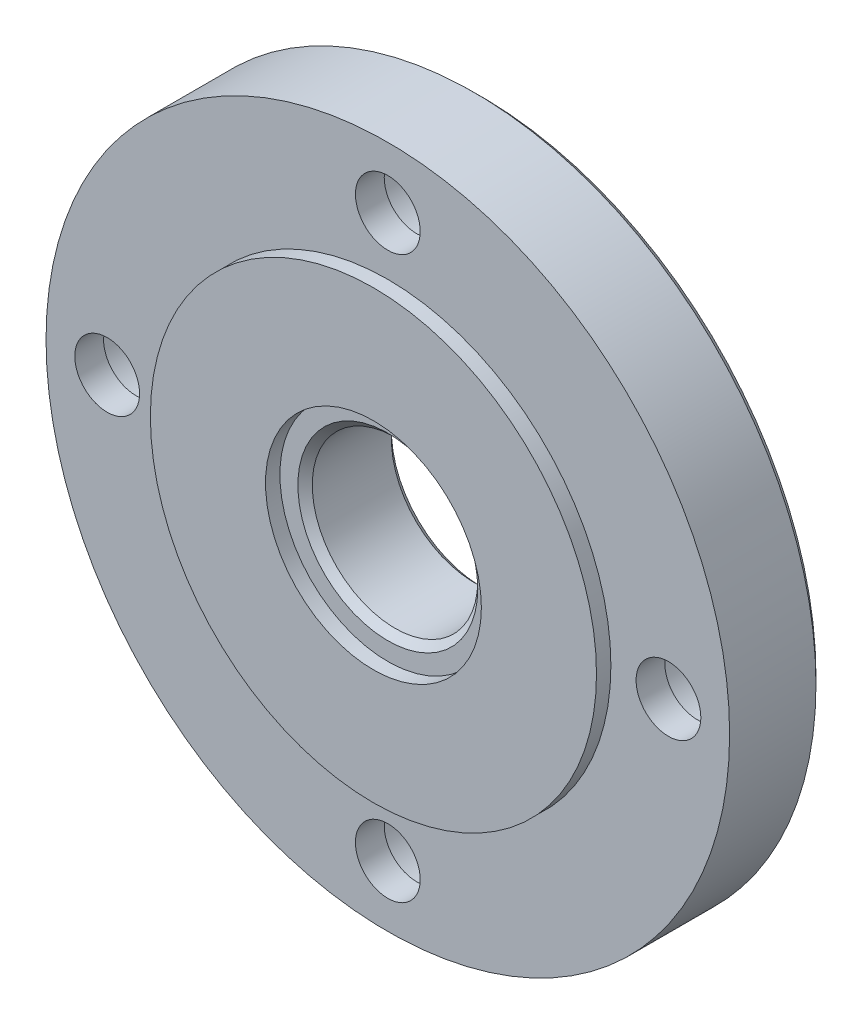
ISO-10303-21;
HEADER;
FILE_DESCRIPTION(('STEP AP214'),'2;1');
FILE_NAME('part.step','',(''),(''),'','','');
FILE_SCHEMA(('AUTOMOTIVE_DESIGN { 1 0 10303 214 1 1 1 1 }'));
ENDSEC;
DATA;
#1=APPLICATION_CONTEXT('core data for automotive mechanical design processes');
#2=APPLICATION_PROTOCOL_DEFINITION('international standard','automotive_design',2000,#1);
#3=PRODUCT_CONTEXT('',#1,'mechanical');
#4=PRODUCT('Part','Part','',(#3));
#5=PRODUCT_RELATED_PRODUCT_CATEGORY('part','',(#4));
#6=PRODUCT_DEFINITION_FORMATION('','',#4);
#7=PRODUCT_DEFINITION_CONTEXT('part definition',#1,'design');
#8=PRODUCT_DEFINITION('design','',#6,#7);
#9=PRODUCT_DEFINITION_SHAPE('','',#8);
#10=(LENGTH_UNIT() NAMED_UNIT(*) SI_UNIT(.MILLI.,.METRE.));
#11=(NAMED_UNIT(*) PLANE_ANGLE_UNIT() SI_UNIT($,.RADIAN.));
#12=(NAMED_UNIT(*) SI_UNIT($,.STERADIAN.) SOLID_ANGLE_UNIT());
#13=UNCERTAINTY_MEASURE_WITH_UNIT(LENGTH_MEASURE(1.E-05),#10,'distance_accuracy_value','');
#14=(GEOMETRIC_REPRESENTATION_CONTEXT(3) GLOBAL_UNCERTAINTY_ASSIGNED_CONTEXT((#13)) GLOBAL_UNIT_ASSIGNED_CONTEXT((#10,
#11,#12)) REPRESENTATION_CONTEXT('',''));
#15=CARTESIAN_POINT('',(0.,0.,0.));
#16=DIRECTION('',(0.,0.,1.));
#17=DIRECTION('',(1.,0.,0.));
#18=AXIS2_PLACEMENT_3D('',#15,#16,#17);
#19=CARTESIAN_POINT('',(0.,0.,13.));
#20=DIRECTION('',(0.,0.,-1.));
#21=DIRECTION('',(-1.,0.,0.));
#22=AXIS2_PLACEMENT_3D('',#19,#20,#21);
#23=CYLINDRICAL_SURFACE('',#22,47.5);
#24=CARTESIAN_POINT('',(0.,0.,1.00000000000004));
#25=DIRECTION('',(0.,0.,1.));
#26=DIRECTION('',(1.,0.,0.));
#27=AXIS2_PLACEMENT_3D('',#24,#25,#26);
#28=CIRCLE('',#27,47.5);
#29=CARTESIAN_POINT('',(-47.5,0.,1.00000000000004));
#30=VERTEX_POINT('',#29);
#31=EDGE_CURVE('E54',#30,#30,#28,.T.);
#32=CARTESIAN_POINT('',(0.,0.,13.));
#33=DIRECTION('',(0.,0.,1.));
#34=DIRECTION('',(1.,0.,0.));
#35=AXIS2_PLACEMENT_3D('',#32,#33,#34);
#36=CIRCLE('',#35,47.5);
#37=CARTESIAN_POINT('',(-47.5,0.,13.));
#38=VERTEX_POINT('',#37);
#39=EDGE_CURVE('E85',#38,#38,#36,.T.);
#40=CARTESIAN_POINT('',(-47.5,0.,1.00000000000004));
#41=CARTESIAN_POINT('',(-47.5,0.,1.12500000000004));
#42=CARTESIAN_POINT('',(-47.5,0.,1.25000000000004));
#43=CARTESIAN_POINT('',(-47.5,0.,1.50000000000004));
#44=CARTESIAN_POINT('',(-47.5,0.,1.62500000000004));
#45=CARTESIAN_POINT('',(-47.5,0.,1.87500000000004));
#46=CARTESIAN_POINT('',(-47.5,0.,2.00000000000004));
#47=CARTESIAN_POINT('',(-47.5,0.,2.25000000000004));
#48=CARTESIAN_POINT('',(-47.5,0.,2.37500000000004));
#49=CARTESIAN_POINT('',(-47.5,0.,2.62500000000004));
#50=CARTESIAN_POINT('',(-47.5,0.,2.75000000000004));
#51=CARTESIAN_POINT('',(-47.5,0.,3.00000000000004));
#52=CARTESIAN_POINT('',(-47.5,0.,3.12500000000003));
#53=CARTESIAN_POINT('',(-47.5,0.,3.37500000000003));
#54=CARTESIAN_POINT('',(-47.5,0.,3.50000000000003));
#55=CARTESIAN_POINT('',(-47.5,0.,3.75000000000003));
#56=CARTESIAN_POINT('',(-47.5,0.,3.87500000000003));
#57=CARTESIAN_POINT('',(-47.5,0.,4.12500000000003));
#58=CARTESIAN_POINT('',(-47.5,0.,4.25000000000003));
#59=CARTESIAN_POINT('',(-47.5,0.,4.50000000000003));
#60=CARTESIAN_POINT('',(-47.5,0.,4.62500000000003));
#61=CARTESIAN_POINT('',(-47.5,0.,4.87500000000003));
#62=CARTESIAN_POINT('',(-47.5,0.,5.00000000000003));
#63=CARTESIAN_POINT('',(-47.5,0.,5.25000000000003));
#64=CARTESIAN_POINT('',(-47.5,0.,5.37500000000003));
#65=CARTESIAN_POINT('',(-47.5,0.,5.62500000000003));
#66=CARTESIAN_POINT('',(-47.5,0.,5.75000000000003));
#67=CARTESIAN_POINT('',(-47.5,0.,6.00000000000002));
#68=CARTESIAN_POINT('',(-47.5,0.,6.12500000000002));
#69=CARTESIAN_POINT('',(-47.5,0.,6.37500000000002));
#70=CARTESIAN_POINT('',(-47.5,0.,6.50000000000002));
#71=CARTESIAN_POINT('',(-47.5,0.,6.75000000000002));
#72=CARTESIAN_POINT('',(-47.5,0.,6.87500000000002));
#73=CARTESIAN_POINT('',(-47.5,0.,7.12500000000002));
#74=CARTESIAN_POINT('',(-47.5,0.,7.25000000000002));
#75=CARTESIAN_POINT('',(-47.5,0.,7.50000000000002));
#76=CARTESIAN_POINT('',(-47.5,0.,7.62500000000002));
#77=CARTESIAN_POINT('',(-47.5,0.,7.87500000000002));
#78=CARTESIAN_POINT('',(-47.5,0.,8.00000000000002));
#79=CARTESIAN_POINT('',(-47.5,0.,8.25000000000002));
#80=CARTESIAN_POINT('',(-47.5,0.,8.37500000000002));
#81=CARTESIAN_POINT('',(-47.5,0.,8.62500000000001));
#82=CARTESIAN_POINT('',(-47.5,0.,8.75000000000001));
#83=CARTESIAN_POINT('',(-47.5,0.,9.00000000000001));
#84=CARTESIAN_POINT('',(-47.5,0.,9.12500000000001));
#85=CARTESIAN_POINT('',(-47.5,0.,9.37500000000001));
#86=CARTESIAN_POINT('',(-47.5,0.,9.50000000000001));
#87=CARTESIAN_POINT('',(-47.5,0.,9.75000000000001));
#88=CARTESIAN_POINT('',(-47.5,0.,9.87500000000001));
#89=CARTESIAN_POINT('',(-47.5,0.,10.125));
#90=CARTESIAN_POINT('',(-47.5,0.,10.25));
#91=CARTESIAN_POINT('',(-47.5,0.,10.5));
#92=CARTESIAN_POINT('',(-47.5,0.,10.625));
#93=CARTESIAN_POINT('',(-47.5,0.,10.875));
#94=CARTESIAN_POINT('',(-47.5,0.,11.));
#95=CARTESIAN_POINT('',(-47.5,0.,11.25));
#96=CARTESIAN_POINT('',(-47.5,0.,11.375));
#97=CARTESIAN_POINT('',(-47.5,0.,11.625));
#98=CARTESIAN_POINT('',(-47.5,0.,11.75));
#99=CARTESIAN_POINT('',(-47.5,0.,12.));
#100=CARTESIAN_POINT('',(-47.5,0.,12.125));
#101=CARTESIAN_POINT('',(-47.5,0.,12.375));
#102=CARTESIAN_POINT('',(-47.5,0.,12.5));
#103=CARTESIAN_POINT('',(-47.5,0.,12.75));
#104=CARTESIAN_POINT('',(-47.5,0.,12.875));
#105=CARTESIAN_POINT('',(-47.5,0.,13.));
#106=B_SPLINE_CURVE_WITH_KNOTS('',3,(#40,#41,#42,#43,#44,#45,#46,#47,#48,#49,#50,#51,#52,#53,
#54,#55,#56,#57,#58,#59,#60,#61,#62,#63,#64,#65,#66,#67,#68,#69,#70,#71,#72,#73,#74,#75,#76,#77,
#78,#79,#80,#81,#82,#83,#84,#85,#86,#87,#88,#89,#90,#91,#92,#93,#94,#95,#96,#97,#98,#99,#100,
#101,#102,#103,#104,#105),.UNSPECIFIED.,.F.,.F.,(4,2,2,2,2,2,2,2,2,2,2,2,2,2,2,2,2,2,2,2,2,2,2,
2,2,2,2,2,2,2,2,2,4),(0.,0.374999999999999,0.749999999999997,1.125,1.49999999999999,
1.87499999999999,2.24999999999999,2.62499999999999,2.99999999999999,3.37499999999999,
3.74999999999999,4.12499999999999,4.49999999999998,4.87499999999998,5.24999999999998,
5.62499999999998,5.99999999999998,6.37499999999998,6.74999999999998,7.12499999999998,
7.49999999999997,7.87499999999997,8.24999999999997,8.62499999999997,8.99999999999997,
9.37499999999997,9.74999999999996,10.125,10.5,10.875,11.25,11.625,12.),.UNSPECIFIED.);
#107=EDGE_CURVE('BSEAM45',#30,#38,#106,.T.);
#108=ORIENTED_EDGE('',*,*,#31,.T.);
#109=ORIENTED_EDGE('',*,*,#39,.F.);
#110=ORIENTED_EDGE('',*,*,#107,.T.);
#111=ORIENTED_EDGE('',*,*,#107,.F.);
#112=EDGE_LOOP('',(#108,#110,#109,#111));
#113=FACE_BOUND('',#112,.T.);
#114=ADVANCED_FACE('F45',(#113),#23,.T.);
#115=CARTESIAN_POINT('',(0.,0.,13.));
#116=DIRECTION('',(0.,0.,1.));
#117=DIRECTION('',(1.,0.,0.));
#118=AXIS2_PLACEMENT_3D('',#115,#116,#117);
#119=PLANE('',#118);
#120=CARTESIAN_POINT('',(-39.,-1.36167772214882E-13,13.));
#121=DIRECTION('',(0.,0.,1.));
#122=DIRECTION('',(0.,1.,0.));
#123=AXIS2_PLACEMENT_3D('',#120,#121,#122);
#124=CIRCLE('',#123,4.5);
#125=CARTESIAN_POINT('',(-39.,4.49999999999987,13.));
#126=VERTEX_POINT('',#125);
#127=EDGE_CURVE('E136',#126,#126,#124,.T.);
#128=ORIENTED_EDGE('',*,*,#127,.F.);
#129=EDGE_LOOP('',(#128));
#130=FACE_BOUND('',#129,.T.);
#131=CARTESIAN_POINT('',(0.,-39.,13.));
#132=DIRECTION('',(0.,0.,1.));
#133=DIRECTION('',(-1.,0.,0.));
#134=AXIS2_PLACEMENT_3D('',#131,#132,#133);
#135=CIRCLE('',#134,4.5);
#136=CARTESIAN_POINT('',(-4.5,-39.,13.));
#137=VERTEX_POINT('',#136);
#138=EDGE_CURVE('E119',#137,#137,#135,.T.);
#139=ORIENTED_EDGE('',*,*,#138,.F.);
#140=EDGE_LOOP('',(#139));
#141=FACE_BOUND('',#140,.T.);
#142=CARTESIAN_POINT('',(39.,4.08503316644647E-13,13.));
#143=DIRECTION('',(0.,0.,1.));
#144=DIRECTION('',(0.,-1.,0.));
#145=AXIS2_PLACEMENT_3D('',#142,#143,#144);
#146=CIRCLE('',#145,4.5);
#147=CARTESIAN_POINT('',(39.,-4.49999999999959,13.));
#148=VERTEX_POINT('',#147);
#149=EDGE_CURVE('E128',#148,#148,#146,.T.);
#150=ORIENTED_EDGE('',*,*,#149,.F.);
#151=EDGE_LOOP('',(#150));
#152=FACE_BOUND('',#151,.T.);
#153=CARTESIAN_POINT('',(0.,39.,13.));
#154=DIRECTION('',(0.,0.,1.));
#155=DIRECTION('',(1.,0.,0.));
#156=AXIS2_PLACEMENT_3D('',#153,#154,#155);
#157=CIRCLE('',#156,4.5);
#158=CARTESIAN_POINT('',(4.5,39.,13.));
#159=VERTEX_POINT('',#158);
#160=EDGE_CURVE('E67',#159,#159,#157,.T.);
#161=ORIENTED_EDGE('',*,*,#160,.F.);
#162=EDGE_LOOP('',(#161));
#163=FACE_BOUND('',#162,.T.);
#164=CARTESIAN_POINT('',(0.,0.,13.));
#165=DIRECTION('',(0.,0.,1.));
#166=DIRECTION('',(1.,0.,0.));
#167=AXIS2_PLACEMENT_3D('',#164,#165,#166);
#168=CIRCLE('',#167,31.);
#169=CARTESIAN_POINT('',(31.,0.,13.));
#170=VERTEX_POINT('',#169);
#171=EDGE_CURVE('E84',#170,#170,#168,.T.);
#172=ORIENTED_EDGE('',*,*,#171,.F.);
#173=EDGE_LOOP('',(#172));
#174=FACE_BOUND('',#173,.T.);
#175=ORIENTED_EDGE('',*,*,#39,.T.);
#176=EDGE_LOOP('',(#175));
#177=FACE_BOUND('',#176,.T.);
#178=ADVANCED_FACE('F166',(#130,#141,#152,#163,#174,#177),#119,.T.);
#179=CARTESIAN_POINT('',(0.,0.,0.));
#180=DIRECTION('',(0.,0.,1.));
#181=DIRECTION('',(1.,0.,0.));
#182=AXIS2_PLACEMENT_3D('',#179,#180,#181);
#183=PLANE('',#182);
#184=CARTESIAN_POINT('',(0.,0.,0.));
#185=DIRECTION('',(0.,0.,1.));
#186=DIRECTION('',(1.,0.,0.));
#187=AXIS2_PLACEMENT_3D('',#184,#185,#186);
#188=CIRCLE('',#187,46.5);
#189=CARTESIAN_POINT('',(46.5,0.,0.));
#190=VERTEX_POINT('',#189);
#191=EDGE_CURVE('E10',#190,#190,#188,.F.);
#192=ORIENTED_EDGE('',*,*,#191,.T.);
#193=EDGE_LOOP('',(#192));
#194=FACE_BOUND('',#193,.T.);
#195=CARTESIAN_POINT('',(-39.,-1.36167772214882E-13,0.));
#196=DIRECTION('',(0.,0.,-1.));
#197=DIRECTION('',(0.,-1.,0.));
#198=AXIS2_PLACEMENT_3D('',#195,#196,#197);
#199=CIRCLE('',#198,7.);
#200=CARTESIAN_POINT('',(-39.,-7.00000000000014,0.));
#201=VERTEX_POINT('',#200);
#202=EDGE_CURVE('E155',#201,#201,#199,.T.);
#203=ORIENTED_EDGE('',*,*,#202,.F.);
#204=EDGE_LOOP('',(#203));
#205=FACE_BOUND('',#204,.T.);
#206=CARTESIAN_POINT('',(0.,-39.,0.));
#207=DIRECTION('',(0.,0.,-1.));
#208=DIRECTION('',(1.,0.,0.));
#209=AXIS2_PLACEMENT_3D('',#206,#207,#208);
#210=CIRCLE('',#209,7.);
#211=CARTESIAN_POINT('',(7.,-39.,0.));
#212=VERTEX_POINT('',#211);
#213=EDGE_CURVE('E141',#212,#212,#210,.T.);
#214=ORIENTED_EDGE('',*,*,#213,.F.);
#215=EDGE_LOOP('',(#214));
#216=FACE_BOUND('',#215,.T.);
#217=CARTESIAN_POINT('',(39.,4.08503316644647E-13,0.));
#218=DIRECTION('',(0.,0.,-1.));
#219=DIRECTION('',(0.,1.,0.));
#220=AXIS2_PLACEMENT_3D('',#217,#218,#219);
#221=CIRCLE('',#220,7.);
#222=CARTESIAN_POINT('',(38.9999999999999,7.00000000000041,0.));
#223=VERTEX_POINT('',#222);
#224=EDGE_CURVE('E124',#223,#223,#221,.T.);
#225=ORIENTED_EDGE('',*,*,#224,.F.);
#226=EDGE_LOOP('',(#225));
#227=FACE_BOUND('',#226,.T.);
#228=CARTESIAN_POINT('',(0.,39.,0.));
#229=DIRECTION('',(0.,0.,-1.));
#230=DIRECTION('',(-1.,0.,0.));
#231=AXIS2_PLACEMENT_3D('',#228,#229,#230);
#232=CIRCLE('',#231,7.);
#233=CARTESIAN_POINT('',(-7.,39.,0.));
#234=VERTEX_POINT('',#233);
#235=EDGE_CURVE('E70',#234,#234,#232,.T.);
#236=ORIENTED_EDGE('',*,*,#235,.F.);
#237=EDGE_LOOP('',(#236));
#238=FACE_BOUND('',#237,.T.);
#239=CARTESIAN_POINT('',(0.,0.,0.));
#240=DIRECTION('',(0.,0.,1.));
#241=DIRECTION('',(1.,0.,0.));
#242=AXIS2_PLACEMENT_3D('',#239,#240,#241);
#243=CIRCLE('',#242,12.4999999999999);
#244=CARTESIAN_POINT('',(12.4999999999999,0.,0.));
#245=VERTEX_POINT('',#244);
#246=EDGE_CURVE('E59',#245,#245,#243,.T.);
#247=ORIENTED_EDGE('',*,*,#246,.T.);
#248=EDGE_LOOP('',(#247));
#249=FACE_BOUND('',#248,.T.);
#250=ADVANCED_FACE('F169',(#194,#205,#216,#227,#238,#249),#183,.F.);
#251=CARTESIAN_POINT('',(0.,0.,15.));
#252=DIRECTION('',(0.,0.,-1.));
#253=DIRECTION('',(-1.,0.,0.));
#254=AXIS2_PLACEMENT_3D('',#251,#252,#253);
#255=CYLINDRICAL_SURFACE('',#254,31.);
#256=CARTESIAN_POINT('',(0.,0.,15.));
#257=DIRECTION('',(0.,0.,1.));
#258=DIRECTION('',(1.,0.,0.));
#259=AXIS2_PLACEMENT_3D('',#256,#257,#258);
#260=CIRCLE('',#259,31.);
#261=CARTESIAN_POINT('',(31.,0.,15.));
#262=VERTEX_POINT('',#261);
#263=EDGE_CURVE('E89',#262,#262,#260,.T.);
#264=ORIENTED_EDGE('',*,*,#263,.F.);
#265=EDGE_LOOP('',(#264));
#266=FACE_BOUND('',#265,.T.);
#267=ORIENTED_EDGE('',*,*,#171,.T.);
#268=EDGE_LOOP('',(#267));
#269=FACE_BOUND('',#268,.T.);
#270=ADVANCED_FACE('F213',(#266,#269),#255,.T.);
#271=CARTESIAN_POINT('',(0.,0.,15.));
#272=DIRECTION('',(0.,0.,1.));
#273=DIRECTION('',(1.,0.,0.));
#274=AXIS2_PLACEMENT_3D('',#271,#272,#273);
#275=PLANE('',#274);
#276=CARTESIAN_POINT('',(0.,0.,15.));
#277=DIRECTION('',(0.,0.,1.));
#278=DIRECTION('',(1.,0.,0.));
#279=AXIS2_PLACEMENT_3D('',#276,#277,#278);
#280=CIRCLE('',#279,15.);
#281=CARTESIAN_POINT('',(15.,0.,15.));
#282=VERTEX_POINT('',#281);
#283=EDGE_CURVE('E97',#282,#282,#280,.T.);
#284=ORIENTED_EDGE('',*,*,#283,.F.);
#285=EDGE_LOOP('',(#284));
#286=FACE_BOUND('',#285,.T.);
#287=ORIENTED_EDGE('',*,*,#263,.T.);
#288=EDGE_LOOP('',(#287));
#289=FACE_BOUND('',#288,.T.);
#290=ADVANCED_FACE('F218',(#286,#289),#275,.T.);
#291=CARTESIAN_POINT('',(0.,0.,13.));
#292=DIRECTION('',(0.,0.,1.));
#293=DIRECTION('',(1.,0.,0.));
#294=AXIS2_PLACEMENT_3D('',#291,#292,#293);
#295=CYLINDRICAL_SURFACE('',#294,15.);
#296=CARTESIAN_POINT('',(0.,0.,13.));
#297=DIRECTION('',(0.,0.,1.));
#298=DIRECTION('',(1.,0.,0.));
#299=AXIS2_PLACEMENT_3D('',#296,#297,#298);
#300=CIRCLE('',#299,15.);
#301=CARTESIAN_POINT('',(15.,0.,13.));
#302=VERTEX_POINT('',#301);
#303=EDGE_CURVE('E96',#302,#302,#300,.T.);
#304=ORIENTED_EDGE('',*,*,#303,.F.);
#305=EDGE_LOOP('',(#304));
#306=FACE_BOUND('',#305,.T.);
#307=ORIENTED_EDGE('',*,*,#283,.T.);
#308=EDGE_LOOP('',(#307));
#309=FACE_BOUND('',#308,.T.);
#310=ADVANCED_FACE('F258',(#306,#309),#295,.F.);
#311=CARTESIAN_POINT('',(0.,0.,13.));
#312=DIRECTION('',(0.,0.,1.));
#313=DIRECTION('',(1.,0.,0.));
#314=AXIS2_PLACEMENT_3D('',#311,#312,#313);
#315=PLANE('',#314);
#316=CARTESIAN_POINT('',(0.,0.,13.));
#317=DIRECTION('',(0.,0.,1.));
#318=DIRECTION('',(1.,0.,0.));
#319=AXIS2_PLACEMENT_3D('',#316,#317,#318);
#320=CIRCLE('',#319,12.5000000000001);
#321=CARTESIAN_POINT('',(12.5000000000001,0.,13.));
#322=VERTEX_POINT('',#321);
#323=EDGE_CURVE('E64',#322,#322,#320,.F.);
#324=ORIENTED_EDGE('',*,*,#323,.T.);
#325=EDGE_LOOP('',(#324));
#326=FACE_BOUND('',#325,.T.);
#327=ORIENTED_EDGE('',*,*,#303,.T.);
#328=EDGE_LOOP('',(#327));
#329=FACE_BOUND('',#328,.T.);
#330=ADVANCED_FACE('F254',(#326,#329),#315,.T.);
#331=CARTESIAN_POINT('',(0.,0.,0.));
#332=DIRECTION('',(0.,0.,1.));
#333=DIRECTION('',(1.,0.,0.));
#334=AXIS2_PLACEMENT_3D('',#331,#332,#333);
#335=CYLINDRICAL_SURFACE('',#334,11.5);
#336=CARTESIAN_POINT('',(0.,0.,11.9999999999999));
#337=DIRECTION('',(0.,0.,1.));
#338=DIRECTION('',(1.,0.,0.));
#339=AXIS2_PLACEMENT_3D('',#336,#337,#338);
#340=CIRCLE('',#339,11.5);
#341=CARTESIAN_POINT('',(11.5,0.,11.9999999999999));
#342=VERTEX_POINT('',#341);
#343=EDGE_CURVE('E76',#342,#342,#340,.T.);
#344=CARTESIAN_POINT('',(0.,0.,0.999999999999959));
#345=DIRECTION('',(0.,0.,1.));
#346=DIRECTION('',(1.,0.,0.));
#347=AXIS2_PLACEMENT_3D('',#344,#345,#346);
#348=CIRCLE('',#347,11.5);
#349=CARTESIAN_POINT('',(11.5,0.,0.999999999999959));
#350=VERTEX_POINT('',#349);
#351=EDGE_CURVE('E80',#350,#350,#348,.F.);
#352=CARTESIAN_POINT('',(11.5,0.,11.9999999999999));
#353=CARTESIAN_POINT('',(11.5,0.,11.8854166666666));
#354=CARTESIAN_POINT('',(11.5,0.,11.7708333333333));
#355=CARTESIAN_POINT('',(11.5,0.,11.5416666666666));
#356=CARTESIAN_POINT('',(11.5,0.,11.4270833333333));
#357=CARTESIAN_POINT('',(11.5,0.,11.1979166666666));
#358=CARTESIAN_POINT('',(11.5,0.,11.0833333333333));
#359=CARTESIAN_POINT('',(11.5,0.,10.8541666666666));
#360=CARTESIAN_POINT('',(11.5,0.,10.7395833333333));
#361=CARTESIAN_POINT('',(11.5,0.,10.5104166666666));
#362=CARTESIAN_POINT('',(11.5,0.,10.3958333333333));
#363=CARTESIAN_POINT('',(11.5,0.,10.1666666666666));
#364=CARTESIAN_POINT('',(11.5,0.,10.0520833333333));
#365=CARTESIAN_POINT('',(11.5,0.,9.82291666666661));
#366=CARTESIAN_POINT('',(11.5,0.,9.70833333333328));
#367=CARTESIAN_POINT('',(11.5,0.,9.47916666666661));
#368=CARTESIAN_POINT('',(11.5,0.,9.36458333333328));
#369=CARTESIAN_POINT('',(11.5,0.,9.13541666666662));
#370=CARTESIAN_POINT('',(11.5,0.,9.02083333333328));
#371=CARTESIAN_POINT('',(11.5,0.,8.79166666666662));
#372=CARTESIAN_POINT('',(11.5,0.,8.67708333333328));
#373=CARTESIAN_POINT('',(11.5,0.,8.44791666666662));
#374=CARTESIAN_POINT('',(11.5,0.,8.33333333333328));
#375=CARTESIAN_POINT('',(11.5,0.,8.10416666666662));
#376=CARTESIAN_POINT('',(11.5,0.,7.98958333333328));
#377=CARTESIAN_POINT('',(11.5,0.,7.76041666666662));
#378=CARTESIAN_POINT('',(11.5,0.,7.64583333333329));
#379=CARTESIAN_POINT('',(11.5,0.,7.41666666666662));
#380=CARTESIAN_POINT('',(11.5,0.,7.30208333333329));
#381=CARTESIAN_POINT('',(11.5,0.,7.07291666666662));
#382=CARTESIAN_POINT('',(11.5,0.,6.95833333333329));
#383=CARTESIAN_POINT('',(11.5,0.,6.72916666666662));
#384=CARTESIAN_POINT('',(11.5,0.,6.61458333333329));
#385=CARTESIAN_POINT('',(11.5,0.,6.38541666666662));
#386=CARTESIAN_POINT('',(11.5,0.,6.27083333333329));
#387=CARTESIAN_POINT('',(11.5,0.,6.04166666666662));
#388=CARTESIAN_POINT('',(11.5,0.,5.92708333333329));
#389=CARTESIAN_POINT('',(11.5,0.,5.69791666666662));
#390=CARTESIAN_POINT('',(11.5,0.,5.58333333333329));
#391=CARTESIAN_POINT('',(11.5,0.,5.35416666666662));
#392=CARTESIAN_POINT('',(11.5,0.,5.23958333333329));
#393=CARTESIAN_POINT('',(11.5,0.,5.01041666666662));
#394=CARTESIAN_POINT('',(11.5,0.,4.89583333333329));
#395=CARTESIAN_POINT('',(11.5,0.,4.66666666666662));
#396=CARTESIAN_POINT('',(11.5,0.,4.55208333333329));
#397=CARTESIAN_POINT('',(11.5,0.,4.32291666666662));
#398=CARTESIAN_POINT('',(11.5,0.,4.20833333333329));
#399=CARTESIAN_POINT('',(11.5,0.,3.97916666666662));
#400=CARTESIAN_POINT('',(11.5,0.,3.86458333333329));
#401=CARTESIAN_POINT('',(11.5,0.,3.63541666666662));
#402=CARTESIAN_POINT('',(11.5,0.,3.52083333333329));
#403=CARTESIAN_POINT('',(11.5,0.,3.29166666666662));
#404=CARTESIAN_POINT('',(11.5,0.,3.17708333333329));
#405=CARTESIAN_POINT('',(11.5,0.,2.94791666666662));
#406=CARTESIAN_POINT('',(11.5,0.,2.83333333333329));
#407=CARTESIAN_POINT('',(11.5,0.,2.60416666666662));
#408=CARTESIAN_POINT('',(11.5,0.,2.48958333333329));
#409=CARTESIAN_POINT('',(11.5,0.,2.26041666666662));
#410=CARTESIAN_POINT('',(11.5,0.,2.14583333333329));
#411=CARTESIAN_POINT('',(11.5,0.,1.91666666666662));
#412=CARTESIAN_POINT('',(11.5,0.,1.80208333333329));
#413=CARTESIAN_POINT('',(11.5,0.,1.57291666666662));
#414=CARTESIAN_POINT('',(11.5,0.,1.45833333333329));
#415=CARTESIAN_POINT('',(11.5,0.,1.22916666666663));
#416=CARTESIAN_POINT('',(11.5,0.,1.11458333333329));
#417=CARTESIAN_POINT('',(11.5,0.,0.999999999999959));
#418=B_SPLINE_CURVE_WITH_KNOTS('',3,(#352,#353,#354,#355,#356,#357,#358,#359,#360,#361,#362,
#363,#364,#365,#366,#367,#368,#369,#370,#371,#372,#373,#374,#375,#376,#377,#378,#379,#380,#381,
#382,#383,#384,#385,#386,#387,#388,#389,#390,#391,#392,#393,#394,#395,#396,#397,#398,#399,#400,
#401,#402,#403,#404,#405,#406,#407,#408,#409,#410,#411,#412,#413,#414,#415,#416,#417),
.UNSPECIFIED.,.F.,.F.,(4,2,2,2,2,2,2,2,2,2,2,2,2,2,2,2,2,2,2,2,2,2,2,2,2,2,2,2,2,2,2,2,4),(0.,
0.34375,0.687499999999999,1.03125,1.375,1.71875,2.0625,2.40625,2.75,3.09375,3.4375,3.78125,
4.125,4.46874999999999,4.81249999999999,5.15624999999999,5.49999999999999,5.84374999999999,
6.18749999999999,6.53124999999999,6.87499999999999,7.21874999999999,7.56249999999999,
7.90624999999999,8.24999999999999,8.59374999999999,8.93749999999999,9.28124999999999,
9.62499999999999,9.96874999999999,10.3125,10.65625,11.),.UNSPECIFIED.);
#419=EDGE_CURVE('BSEAM196',#342,#350,#418,.T.);
#420=ORIENTED_EDGE('',*,*,#343,.T.);
#421=ORIENTED_EDGE('',*,*,#351,.T.);
#422=ORIENTED_EDGE('',*,*,#419,.T.);
#423=ORIENTED_EDGE('',*,*,#419,.F.);
#424=EDGE_LOOP('',(#420,#422,#421,#423));
#425=FACE_BOUND('',#424,.T.);
#426=ADVANCED_FACE('F196',(#425),#335,.F.);
#427=CARTESIAN_POINT('',(0.,0.,11.9999999999999));
#428=DIRECTION('',(0.,0.,1.));
#429=DIRECTION('',(1.,0.,0.));
#430=AXIS2_PLACEMENT_3D('',#427,#428,#429);
#431=CONICAL_SURFACE('',#430,11.5,0.785398163397449);
#432=ORIENTED_EDGE('',*,*,#323,.F.);
#433=EDGE_LOOP('',(#432));
#434=FACE_BOUND('',#433,.T.);
#435=ORIENTED_EDGE('',*,*,#343,.F.);
#436=EDGE_LOOP('',(#435));
#437=FACE_BOUND('',#436,.T.);
#438=ADVANCED_FACE('F190',(#434,#437),#431,.F.);
#439=CARTESIAN_POINT('',(0.,0.,0.));
#440=DIRECTION('',(0.,0.,-1.));
#441=DIRECTION('',(-1.,0.,0.));
#442=AXIS2_PLACEMENT_3D('',#439,#440,#441);
#443=CONICAL_SURFACE('',#442,12.4999999999999,0.78539816339744);
#444=ORIENTED_EDGE('',*,*,#351,.F.);
#445=EDGE_LOOP('',(#444));
#446=FACE_BOUND('',#445,.T.);
#447=ORIENTED_EDGE('',*,*,#246,.F.);
#448=EDGE_LOOP('',(#447));
#449=FACE_BOUND('',#448,.T.);
#450=ADVANCED_FACE('F195',(#446,#449),#443,.F.);
#451=CARTESIAN_POINT('',(0.,39.,9.));
#452=DIRECTION('',(0.,0.,-1.));
#453=DIRECTION('',(-1.,0.,0.));
#454=AXIS2_PLACEMENT_3D('',#451,#452,#453);
#455=CYLINDRICAL_SURFACE('',#454,7.);
#456=CARTESIAN_POINT('',(0.,39.,9.));
#457=DIRECTION('',(0.,0.,-1.));
#458=DIRECTION('',(-1.,0.,0.));
#459=AXIS2_PLACEMENT_3D('',#456,#457,#458);
#460=CIRCLE('',#459,7.);
#461=CARTESIAN_POINT('',(-7.,39.,9.));
#462=VERTEX_POINT('',#461);
#463=EDGE_CURVE('E101',#462,#462,#460,.T.);
#464=ORIENTED_EDGE('',*,*,#463,.F.);
#465=EDGE_LOOP('',(#464));
#466=FACE_BOUND('',#465,.T.);
#467=ORIENTED_EDGE('',*,*,#235,.T.);
#468=EDGE_LOOP('',(#467));
#469=FACE_BOUND('',#468,.T.);
#470=ADVANCED_FACE('F201',(#466,#469),#455,.F.);
#471=CARTESIAN_POINT('',(0.,39.,9.));
#472=DIRECTION('',(0.,0.,-1.));
#473=DIRECTION('',(-1.,0.,0.));
#474=AXIS2_PLACEMENT_3D('',#471,#472,#473);
#475=PLANE('',#474);
#476=CARTESIAN_POINT('',(0.,39.,9.));
#477=DIRECTION('',(0.,0.,-1.));
#478=DIRECTION('',(-1.,0.,0.));
#479=AXIS2_PLACEMENT_3D('',#476,#477,#478);
#480=CIRCLE('',#479,4.5);
#481=CARTESIAN_POINT('',(-4.5,39.,9.));
#482=VERTEX_POINT('',#481);
#483=EDGE_CURVE('E71',#482,#482,#480,.T.);
#484=ORIENTED_EDGE('',*,*,#483,.F.);
#485=EDGE_LOOP('',(#484));
#486=FACE_BOUND('',#485,.T.);
#487=ORIENTED_EDGE('',*,*,#463,.T.);
#488=EDGE_LOOP('',(#487));
#489=FACE_BOUND('',#488,.T.);
#490=ADVANCED_FACE('F206',(#486,#489),#475,.T.);
#491=CARTESIAN_POINT('',(0.,39.,15.));
#492=DIRECTION('',(0.,0.,-1.));
#493=DIRECTION('',(-1.,0.,0.));
#494=AXIS2_PLACEMENT_3D('',#491,#492,#493);
#495=CYLINDRICAL_SURFACE('',#494,4.5);
#496=ORIENTED_EDGE('',*,*,#160,.T.);
#497=EDGE_LOOP('',(#496));
#498=FACE_BOUND('',#497,.T.);
#499=ORIENTED_EDGE('',*,*,#483,.T.);
#500=EDGE_LOOP('',(#499));
#501=FACE_BOUND('',#500,.T.);
#502=ADVANCED_FACE('F234',(#498,#501),#495,.F.);
#503=CARTESIAN_POINT('',(39.,4.08503316644647E-13,9.));
#504=DIRECTION('',(0.,0.,-1.));
#505=DIRECTION('',(0.,1.,0.));
#506=AXIS2_PLACEMENT_3D('',#503,#504,#505);
#507=CYLINDRICAL_SURFACE('',#506,7.);
#508=CARTESIAN_POINT('',(39.,4.08503316644647E-13,9.));
#509=DIRECTION('',(0.,0.,-1.));
#510=DIRECTION('',(0.,1.,0.));
#511=AXIS2_PLACEMENT_3D('',#508,#509,#510);
#512=CIRCLE('',#511,7.);
#513=CARTESIAN_POINT('',(38.9999999999999,7.00000000000041,9.));
#514=VERTEX_POINT('',#513);
#515=EDGE_CURVE('E115',#514,#514,#512,.T.);
#516=ORIENTED_EDGE('',*,*,#515,.F.);
#517=EDGE_LOOP('',(#516));
#518=FACE_BOUND('',#517,.T.);
#519=ORIENTED_EDGE('',*,*,#224,.T.);
#520=EDGE_LOOP('',(#519));
#521=FACE_BOUND('',#520,.T.);
#522=ADVANCED_FACE('F231',(#518,#521),#507,.F.);
#523=CARTESIAN_POINT('',(39.,4.08503316644647E-13,9.));
#524=DIRECTION('',(0.,0.,-1.));
#525=DIRECTION('',(0.,1.,0.));
#526=AXIS2_PLACEMENT_3D('',#523,#524,#525);
#527=PLANE('',#526);
#528=CARTESIAN_POINT('',(39.,4.08503316644647E-13,9.));
#529=DIRECTION('',(0.,0.,-1.));
#530=DIRECTION('',(0.,1.,0.));
#531=AXIS2_PLACEMENT_3D('',#528,#529,#530);
#532=CIRCLE('',#531,4.5);
#533=CARTESIAN_POINT('',(39.,4.50000000000041,9.));
#534=VERTEX_POINT('',#533);
#535=EDGE_CURVE('E120',#534,#534,#532,.T.);
#536=ORIENTED_EDGE('',*,*,#535,.F.);
#537=EDGE_LOOP('',(#536));
#538=FACE_BOUND('',#537,.T.);
#539=ORIENTED_EDGE('',*,*,#515,.T.);
#540=EDGE_LOOP('',(#539));
#541=FACE_BOUND('',#540,.T.);
#542=ADVANCED_FACE('F233',(#538,#541),#527,.T.);
#543=CARTESIAN_POINT('',(39.,4.08503316644647E-13,15.));
#544=DIRECTION('',(0.,0.,-1.));
#545=DIRECTION('',(0.,1.,0.));
#546=AXIS2_PLACEMENT_3D('',#543,#544,#545);
#547=CYLINDRICAL_SURFACE('',#546,4.5);
#548=ORIENTED_EDGE('',*,*,#149,.T.);
#549=EDGE_LOOP('',(#548));
#550=FACE_BOUND('',#549,.T.);
#551=ORIENTED_EDGE('',*,*,#535,.T.);
#552=EDGE_LOOP('',(#551));
#553=FACE_BOUND('',#552,.T.);
#554=ADVANCED_FACE('F240',(#550,#553),#547,.F.);
#555=CARTESIAN_POINT('',(0.,-39.,9.));
#556=DIRECTION('',(0.,0.,-1.));
#557=DIRECTION('',(1.,0.,0.));
#558=AXIS2_PLACEMENT_3D('',#555,#556,#557);
#559=CYLINDRICAL_SURFACE('',#558,7.);
#560=CARTESIAN_POINT('',(0.,-39.,9.));
#561=DIRECTION('',(0.,0.,-1.));
#562=DIRECTION('',(1.,0.,0.));
#563=AXIS2_PLACEMENT_3D('',#560,#561,#562);
#564=CIRCLE('',#563,7.);
#565=CARTESIAN_POINT('',(7.,-39.,9.));
#566=VERTEX_POINT('',#565);
#567=EDGE_CURVE('E132',#566,#566,#564,.T.);
#568=ORIENTED_EDGE('',*,*,#567,.F.);
#569=EDGE_LOOP('',(#568));
#570=FACE_BOUND('',#569,.T.);
#571=ORIENTED_EDGE('',*,*,#213,.T.);
#572=EDGE_LOOP('',(#571));
#573=FACE_BOUND('',#572,.T.);
#574=ADVANCED_FACE('F338',(#570,#573),#559,.F.);
#575=CARTESIAN_POINT('',(0.,-39.,9.));
#576=DIRECTION('',(0.,0.,-1.));
#577=DIRECTION('',(1.,0.,0.));
#578=AXIS2_PLACEMENT_3D('',#575,#576,#577);
#579=PLANE('',#578);
#580=CARTESIAN_POINT('',(0.,-39.,9.));
#581=DIRECTION('',(0.,0.,-1.));
#582=DIRECTION('',(1.,0.,0.));
#583=AXIS2_PLACEMENT_3D('',#580,#581,#582);
#584=CIRCLE('',#583,4.5);
#585=CARTESIAN_POINT('',(4.5,-39.,9.));
#586=VERTEX_POINT('',#585);
#587=EDGE_CURVE('E137',#586,#586,#584,.T.);
#588=ORIENTED_EDGE('',*,*,#587,.F.);
#589=EDGE_LOOP('',(#588));
#590=FACE_BOUND('',#589,.T.);
#591=ORIENTED_EDGE('',*,*,#567,.T.);
#592=EDGE_LOOP('',(#591));
#593=FACE_BOUND('',#592,.T.);
#594=ADVANCED_FACE('F348',(#590,#593),#579,.T.);
#595=CARTESIAN_POINT('',(0.,-39.,15.));
#596=DIRECTION('',(0.,0.,-1.));
#597=DIRECTION('',(1.,0.,0.));
#598=AXIS2_PLACEMENT_3D('',#595,#596,#597);
#599=CYLINDRICAL_SURFACE('',#598,4.5);
#600=ORIENTED_EDGE('',*,*,#138,.T.);
#601=EDGE_LOOP('',(#600));
#602=FACE_BOUND('',#601,.T.);
#603=ORIENTED_EDGE('',*,*,#587,.T.);
#604=EDGE_LOOP('',(#603));
#605=FACE_BOUND('',#604,.T.);
#606=ADVANCED_FACE('F359',(#602,#605),#599,.F.);
#607=CARTESIAN_POINT('',(-39.,-1.36167772214882E-13,9.));
#608=DIRECTION('',(0.,0.,-1.));
#609=DIRECTION('',(0.,-1.,0.));
#610=AXIS2_PLACEMENT_3D('',#607,#608,#609);
#611=CYLINDRICAL_SURFACE('',#610,7.);
#612=CARTESIAN_POINT('',(-39.,-1.36167772214882E-13,9.));
#613=DIRECTION('',(0.,0.,-1.));
#614=DIRECTION('',(0.,-1.,0.));
#615=AXIS2_PLACEMENT_3D('',#612,#613,#614);
#616=CIRCLE('',#615,7.);
#617=CARTESIAN_POINT('',(-39.,-7.00000000000014,9.));
#618=VERTEX_POINT('',#617);
#619=EDGE_CURVE('E114',#618,#618,#616,.T.);
#620=ORIENTED_EDGE('',*,*,#619,.F.);
#621=EDGE_LOOP('',(#620));
#622=FACE_BOUND('',#621,.T.);
#623=ORIENTED_EDGE('',*,*,#202,.T.);
#624=EDGE_LOOP('',(#623));
#625=FACE_BOUND('',#624,.T.);
#626=ADVANCED_FACE('F368',(#622,#625),#611,.F.);
#627=CARTESIAN_POINT('',(-39.,-1.36167772214882E-13,9.));
#628=DIRECTION('',(0.,0.,-1.));
#629=DIRECTION('',(0.,-1.,0.));
#630=AXIS2_PLACEMENT_3D('',#627,#628,#629);
#631=PLANE('',#630);
#632=CARTESIAN_POINT('',(-39.,-1.36167772214882E-13,9.));
#633=DIRECTION('',(0.,0.,-1.));
#634=DIRECTION('',(0.,-1.,0.));
#635=AXIS2_PLACEMENT_3D('',#632,#633,#634);
#636=CIRCLE('',#635,4.5);
#637=CARTESIAN_POINT('',(-39.,-4.50000000000014,9.));
#638=VERTEX_POINT('',#637);
#639=EDGE_CURVE('E151',#638,#638,#636,.T.);
#640=ORIENTED_EDGE('',*,*,#639,.F.);
#641=EDGE_LOOP('',(#640));
#642=FACE_BOUND('',#641,.T.);
#643=ORIENTED_EDGE('',*,*,#619,.T.);
#644=EDGE_LOOP('',(#643));
#645=FACE_BOUND('',#644,.T.);
#646=ADVANCED_FACE('F377',(#642,#645),#631,.T.);
#647=CARTESIAN_POINT('',(-39.,-1.36167772214882E-13,15.));
#648=DIRECTION('',(0.,0.,-1.));
#649=DIRECTION('',(0.,-1.,0.));
#650=AXIS2_PLACEMENT_3D('',#647,#648,#649);
#651=CYLINDRICAL_SURFACE('',#650,4.5);
#652=ORIENTED_EDGE('',*,*,#127,.T.);
#653=EDGE_LOOP('',(#652));
#654=FACE_BOUND('',#653,.T.);
#655=ORIENTED_EDGE('',*,*,#639,.T.);
#656=EDGE_LOOP('',(#655));
#657=FACE_BOUND('',#656,.T.);
#658=ADVANCED_FACE('F163',(#654,#657),#651,.F.);
#659=CARTESIAN_POINT('',(0.,0.,1.00000000000004));
#660=DIRECTION('',(0.,0.,1.));
#661=DIRECTION('',(1.,0.,0.));
#662=AXIS2_PLACEMENT_3D('',#659,#660,#661);
#663=CONICAL_SURFACE('',#662,47.5,0.785398163397448);
#664=ORIENTED_EDGE('',*,*,#191,.F.);
#665=EDGE_LOOP('',(#664));
#666=FACE_BOUND('',#665,.T.);
#667=ORIENTED_EDGE('',*,*,#31,.F.);
#668=EDGE_LOOP('',(#667));
#669=FACE_BOUND('',#668,.T.);
#670=ADVANCED_FACE('F48',(#666,#669),#663,.T.);
#671=CLOSED_SHELL('',(#114,#178,#250,#270,#290,#310,#330,#426,#438,#450,#470,#490,#502,#522,
#542,#554,#574,#594,#606,#626,#646,#658,#670));
#672=MANIFOLD_SOLID_BREP('B2',#671);
#673=ADVANCED_BREP_SHAPE_REPRESENTATION('',(#18,#672),#14);
#674=SHAPE_DEFINITION_REPRESENTATION(#9,#673);
ENDSEC;
END-ISO-10303-21;
